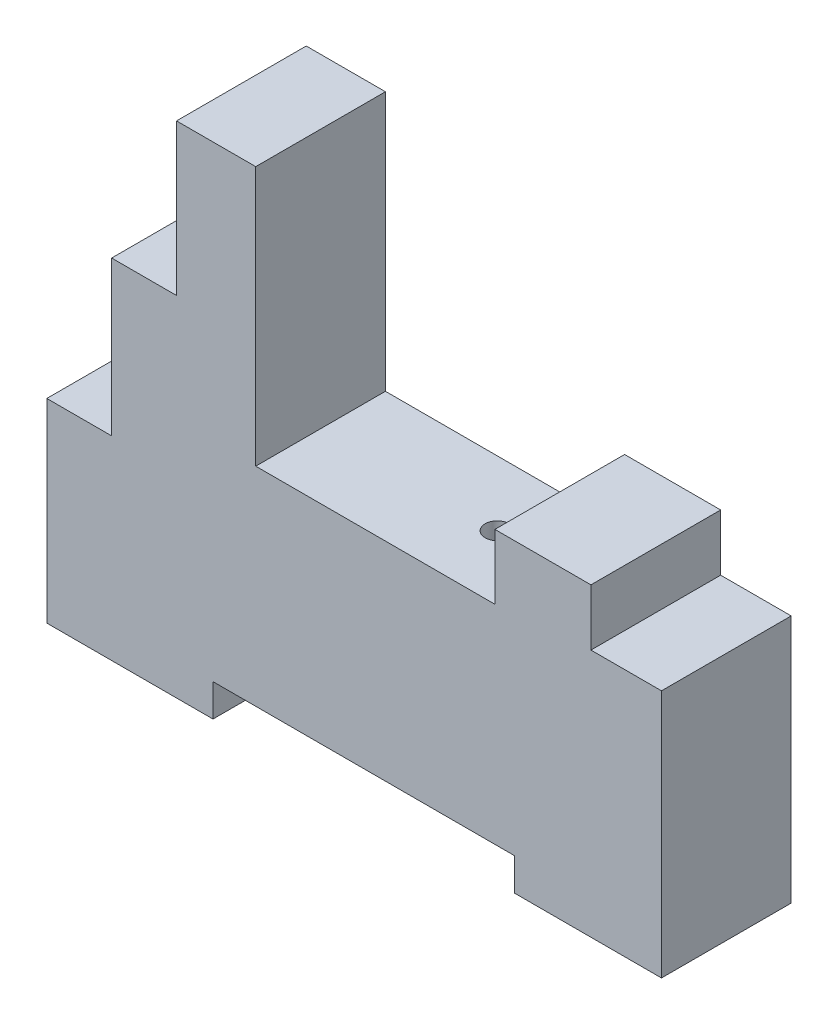
ISO-10303-21;
HEADER;
FILE_DESCRIPTION(('STEP AP214'),'2;1');
FILE_NAME('part.step','',(''),(''),'','','');
FILE_SCHEMA(('AUTOMOTIVE_DESIGN { 1 0 10303 214 1 1 1 1 }'));
ENDSEC;
DATA;
#1=APPLICATION_CONTEXT('core data for automotive mechanical design processes');
#2=APPLICATION_PROTOCOL_DEFINITION('international standard','automotive_design',2000,#1);
#3=PRODUCT_CONTEXT('',#1,'mechanical');
#4=PRODUCT('Part','Part','',(#3));
#5=PRODUCT_RELATED_PRODUCT_CATEGORY('part','',(#4));
#6=PRODUCT_DEFINITION_FORMATION('','',#4);
#7=PRODUCT_DEFINITION_CONTEXT('part definition',#1,'design');
#8=PRODUCT_DEFINITION('design','',#6,#7);
#9=PRODUCT_DEFINITION_SHAPE('','',#8);
#10=(LENGTH_UNIT() NAMED_UNIT(*) SI_UNIT(.MILLI.,.METRE.));
#11=(NAMED_UNIT(*) PLANE_ANGLE_UNIT() SI_UNIT($,.RADIAN.));
#12=(NAMED_UNIT(*) SI_UNIT($,.STERADIAN.) SOLID_ANGLE_UNIT());
#13=UNCERTAINTY_MEASURE_WITH_UNIT(LENGTH_MEASURE(1.E-05),#10,'distance_accuracy_value','');
#14=(GEOMETRIC_REPRESENTATION_CONTEXT(3) GLOBAL_UNCERTAINTY_ASSIGNED_CONTEXT((#13)) GLOBAL_UNIT_ASSIGNED_CONTEXT((#10,
#11,#12)) REPRESENTATION_CONTEXT('',''));
#15=CARTESIAN_POINT('',(0.,0.,0.));
#16=DIRECTION('',(0.,0.,1.));
#17=DIRECTION('',(1.,0.,0.));
#18=AXIS2_PLACEMENT_3D('',#15,#16,#17);
#19=CARTESIAN_POINT('',(20.5,0.,16.));
#20=DIRECTION('',(0.,1.,0.));
#21=DIRECTION('',(-1.,0.,0.));
#22=AXIS2_PLACEMENT_3D('',#19,#20,#21);
#23=PLANE('',#22);
#24=DIRECTION('',(1.,0.,0.));
#25=VECTOR('',#24,1.);
#26=CARTESIAN_POINT('',(20.5,0.,0.));
#27=LINE('',#26,#25);
#28=CARTESIAN_POINT('',(0.,0.,0.));
#29=VERTEX_POINT('',#28);
#30=CARTESIAN_POINT('',(20.5,0.,0.));
#31=VERTEX_POINT('',#30);
#32=EDGE_CURVE('E188',#29,#31,#27,.T.);
#33=ORIENTED_EDGE('',*,*,#32,.T.);
#34=DIRECTION('',(0.,0.,-1.));
#35=VECTOR('',#34,1.);
#36=CARTESIAN_POINT('',(20.5,0.,16.));
#37=LINE('',#36,#35);
#38=CARTESIAN_POINT('',(20.5,0.,16.));
#39=VERTEX_POINT('',#38);
#40=EDGE_CURVE('E11',#39,#31,#37,.T.);
#41=ORIENTED_EDGE('',*,*,#40,.F.);
#42=DIRECTION('',(1.,0.,0.));
#43=VECTOR('',#42,1.);
#44=CARTESIAN_POINT('',(20.5,0.,16.));
#45=LINE('',#44,#43);
#46=CARTESIAN_POINT('',(0.,0.,16.));
#47=VERTEX_POINT('',#46);
#48=EDGE_CURVE('E223',#47,#39,#45,.T.);
#49=ORIENTED_EDGE('',*,*,#48,.F.);
#50=DIRECTION('',(0.,0.,-1.));
#51=VECTOR('',#50,1.);
#52=CARTESIAN_POINT('',(0.,0.,16.));
#53=LINE('',#52,#51);
#54=EDGE_CURVE('E184',#47,#29,#53,.T.);
#55=ORIENTED_EDGE('',*,*,#54,.T.);
#56=EDGE_LOOP('',(#33,#41,#49,#55));
#57=FACE_BOUND('',#56,.T.);
#58=ADVANCED_FACE('F32',(#57),#23,.F.);
#59=CARTESIAN_POINT('',(20.5,4.,16.));
#60=DIRECTION('',(-1.,0.,0.));
#61=DIRECTION('',(0.,0.,1.));
#62=AXIS2_PLACEMENT_3D('',#59,#60,#61);
#63=PLANE('',#62);
#64=DIRECTION('',(0.,1.,0.));
#65=VECTOR('',#64,1.);
#66=CARTESIAN_POINT('',(20.5,4.,0.));
#67=LINE('',#66,#65);
#68=CARTESIAN_POINT('',(20.5,4.,0.));
#69=VERTEX_POINT('',#68);
#70=EDGE_CURVE('E191',#31,#69,#67,.T.);
#71=ORIENTED_EDGE('',*,*,#70,.T.);
#72=DIRECTION('',(0.,0.,-1.));
#73=VECTOR('',#72,1.);
#74=CARTESIAN_POINT('',(20.5,4.,16.));
#75=LINE('',#74,#73);
#76=CARTESIAN_POINT('',(20.5,4.,16.));
#77=VERTEX_POINT('',#76);
#78=EDGE_CURVE('E40',#77,#69,#75,.T.);
#79=ORIENTED_EDGE('',*,*,#78,.F.);
#80=DIRECTION('',(0.,1.,0.));
#81=VECTOR('',#80,1.);
#82=CARTESIAN_POINT('',(20.5,4.,16.));
#83=LINE('',#82,#81);
#84=EDGE_CURVE('E121',#39,#77,#83,.T.);
#85=ORIENTED_EDGE('',*,*,#84,.F.);
#86=ORIENTED_EDGE('',*,*,#40,.T.);
#87=EDGE_LOOP('',(#71,#79,#85,#86));
#88=FACE_BOUND('',#87,.T.);
#89=ADVANCED_FACE('F331',(#88),#63,.F.);
#90=CARTESIAN_POINT('',(57.7,4.,16.));
#91=DIRECTION('',(0.,1.,0.));
#92=DIRECTION('',(-1.,0.,0.));
#93=AXIS2_PLACEMENT_3D('',#90,#91,#92);
#94=PLANE('',#93);
#95=CARTESIAN_POINT('',(47.57,4.,8.));
#96=DIRECTION('',(0.,1.,0.));
#97=DIRECTION('',(-1.,0.,0.));
#98=AXIS2_PLACEMENT_3D('',#95,#96,#97);
#99=CIRCLE('',#98,1.5);
#100=CARTESIAN_POINT('',(47.57,4.,9.50000000000001));
#101=VERTEX_POINT('',#100);
#102=EDGE_CURVE('E192',#101,#101,#99,.T.);
#103=ORIENTED_EDGE('',*,*,#102,.T.);
#104=EDGE_LOOP('',(#103));
#105=FACE_BOUND('',#104,.T.);
#106=DIRECTION('',(1.,0.,0.));
#107=VECTOR('',#106,1.);
#108=CARTESIAN_POINT('',(57.7,4.,0.));
#109=LINE('',#108,#107);
#110=CARTESIAN_POINT('',(57.7,4.,0.));
#111=VERTEX_POINT('',#110);
#112=EDGE_CURVE('E194',#69,#111,#109,.T.);
#113=ORIENTED_EDGE('',*,*,#112,.T.);
#114=DIRECTION('',(0.,0.,-1.));
#115=VECTOR('',#114,1.);
#116=CARTESIAN_POINT('',(57.7,4.,16.));
#117=LINE('',#116,#115);
#118=CARTESIAN_POINT('',(57.7,4.,16.));
#119=VERTEX_POINT('',#118);
#120=EDGE_CURVE('E260',#119,#111,#117,.T.);
#121=ORIENTED_EDGE('',*,*,#120,.F.);
#122=DIRECTION('',(1.,0.,0.));
#123=VECTOR('',#122,1.);
#124=CARTESIAN_POINT('',(57.7,4.,16.));
#125=LINE('',#124,#123);
#126=EDGE_CURVE('E268',#77,#119,#125,.T.);
#127=ORIENTED_EDGE('',*,*,#126,.F.);
#128=ORIENTED_EDGE('',*,*,#78,.T.);
#129=EDGE_LOOP('',(#113,#121,#127,#128));
#130=FACE_BOUND('',#129,.T.);
#131=ADVANCED_FACE('F266',(#105,#130),#94,.F.);
#132=CARTESIAN_POINT('',(57.7,0.,16.));
#133=DIRECTION('',(1.,0.,0.));
#134=DIRECTION('',(0.,0.,-1.));
#135=AXIS2_PLACEMENT_3D('',#132,#133,#134);
#136=PLANE('',#135);
#137=DIRECTION('',(0.,-1.,0.));
#138=VECTOR('',#137,1.);
#139=CARTESIAN_POINT('',(57.7,0.,0.));
#140=LINE('',#139,#138);
#141=CARTESIAN_POINT('',(57.7,0.,0.));
#142=VERTEX_POINT('',#141);
#143=EDGE_CURVE('E196',#111,#142,#140,.T.);
#144=ORIENTED_EDGE('',*,*,#143,.T.);
#145=DIRECTION('',(0.,0.,-1.));
#146=VECTOR('',#145,1.);
#147=CARTESIAN_POINT('',(57.7,0.,16.));
#148=LINE('',#147,#146);
#149=CARTESIAN_POINT('',(57.7,0.,16.));
#150=VERTEX_POINT('',#149);
#151=EDGE_CURVE('E257',#150,#142,#148,.T.);
#152=ORIENTED_EDGE('',*,*,#151,.F.);
#153=DIRECTION('',(0.,-1.,0.));
#154=VECTOR('',#153,1.);
#155=CARTESIAN_POINT('',(57.7,0.,16.));
#156=LINE('',#155,#154);
#157=EDGE_CURVE('E286',#119,#150,#156,.T.);
#158=ORIENTED_EDGE('',*,*,#157,.F.);
#159=ORIENTED_EDGE('',*,*,#120,.T.);
#160=EDGE_LOOP('',(#144,#152,#158,#159));
#161=FACE_BOUND('',#160,.T.);
#162=ADVANCED_FACE('F277',(#161),#136,.F.);
#163=CARTESIAN_POINT('',(75.82,0.,16.));
#164=DIRECTION('',(0.,1.,0.));
#165=DIRECTION('',(-1.,0.,0.));
#166=AXIS2_PLACEMENT_3D('',#163,#164,#165);
#167=PLANE('',#166);
#168=DIRECTION('',(1.,0.,0.));
#169=VECTOR('',#168,1.);
#170=CARTESIAN_POINT('',(75.82,0.,0.));
#171=LINE('',#170,#169);
#172=CARTESIAN_POINT('',(75.82,0.,0.));
#173=VERTEX_POINT('',#172);
#174=EDGE_CURVE('E198',#142,#173,#171,.T.);
#175=ORIENTED_EDGE('',*,*,#174,.T.);
#176=DIRECTION('',(0.,0.,-1.));
#177=VECTOR('',#176,1.);
#178=CARTESIAN_POINT('',(75.82,0.,16.));
#179=LINE('',#178,#177);
#180=CARTESIAN_POINT('',(75.82,0.,16.));
#181=VERTEX_POINT('',#180);
#182=EDGE_CURVE('E254',#181,#173,#179,.T.);
#183=ORIENTED_EDGE('',*,*,#182,.F.);
#184=DIRECTION('',(1.,0.,0.));
#185=VECTOR('',#184,1.);
#186=CARTESIAN_POINT('',(75.82,0.,16.));
#187=LINE('',#186,#185);
#188=EDGE_CURVE('E283',#150,#181,#187,.T.);
#189=ORIENTED_EDGE('',*,*,#188,.F.);
#190=ORIENTED_EDGE('',*,*,#151,.T.);
#191=EDGE_LOOP('',(#175,#183,#189,#190));
#192=FACE_BOUND('',#191,.T.);
#193=ADVANCED_FACE('F281',(#192),#167,.F.);
#194=CARTESIAN_POINT('',(75.82,30.68,16.));
#195=DIRECTION('',(-1.,0.,0.));
#196=DIRECTION('',(0.,0.,1.));
#197=AXIS2_PLACEMENT_3D('',#194,#195,#196);
#198=PLANE('',#197);
#199=DIRECTION('',(0.,1.,0.));
#200=VECTOR('',#199,1.);
#201=CARTESIAN_POINT('',(75.82,30.68,0.));
#202=LINE('',#201,#200);
#203=CARTESIAN_POINT('',(75.82,30.68,0.));
#204=VERTEX_POINT('',#203);
#205=EDGE_CURVE('E200',#173,#204,#202,.T.);
#206=ORIENTED_EDGE('',*,*,#205,.T.);
#207=DIRECTION('',(0.,0.,-1.));
#208=VECTOR('',#207,1.);
#209=CARTESIAN_POINT('',(75.82,30.68,16.));
#210=LINE('',#209,#208);
#211=CARTESIAN_POINT('',(75.82,30.68,16.));
#212=VERTEX_POINT('',#211);
#213=EDGE_CURVE('E251',#212,#204,#210,.T.);
#214=ORIENTED_EDGE('',*,*,#213,.F.);
#215=DIRECTION('',(0.,1.,0.));
#216=VECTOR('',#215,1.);
#217=CARTESIAN_POINT('',(75.82,30.68,16.));
#218=LINE('',#217,#216);
#219=EDGE_CURVE('E285',#181,#212,#218,.T.);
#220=ORIENTED_EDGE('',*,*,#219,.F.);
#221=ORIENTED_EDGE('',*,*,#182,.T.);
#222=EDGE_LOOP('',(#206,#214,#220,#221));
#223=FACE_BOUND('',#222,.T.);
#224=ADVANCED_FACE('F345',(#223),#198,.F.);
#225=CARTESIAN_POINT('',(67.12,30.68,16.));
#226=DIRECTION('',(0.,-1.,0.));
#227=DIRECTION('',(0.,0.,-1.));
#228=AXIS2_PLACEMENT_3D('',#225,#226,#227);
#229=PLANE('',#228);
#230=DIRECTION('',(-1.,0.,0.));
#231=VECTOR('',#230,1.);
#232=CARTESIAN_POINT('',(67.12,30.68,0.));
#233=LINE('',#232,#231);
#234=CARTESIAN_POINT('',(67.12,30.68,0.));
#235=VERTEX_POINT('',#234);
#236=EDGE_CURVE('E202',#204,#235,#233,.T.);
#237=ORIENTED_EDGE('',*,*,#236,.T.);
#238=DIRECTION('',(0.,0.,-1.));
#239=VECTOR('',#238,1.);
#240=CARTESIAN_POINT('',(67.12,30.68,16.));
#241=LINE('',#240,#239);
#242=CARTESIAN_POINT('',(67.12,30.68,16.));
#243=VERTEX_POINT('',#242);
#244=EDGE_CURVE('E248',#243,#235,#241,.T.);
#245=ORIENTED_EDGE('',*,*,#244,.F.);
#246=DIRECTION('',(-1.,0.,0.));
#247=VECTOR('',#246,1.);
#248=CARTESIAN_POINT('',(67.12,30.68,16.));
#249=LINE('',#248,#247);
#250=EDGE_CURVE('E288',#212,#243,#249,.T.);
#251=ORIENTED_EDGE('',*,*,#250,.F.);
#252=ORIENTED_EDGE('',*,*,#213,.T.);
#253=EDGE_LOOP('',(#237,#245,#251,#252));
#254=FACE_BOUND('',#253,.T.);
#255=ADVANCED_FACE('F348',(#254),#229,.F.);
#256=CARTESIAN_POINT('',(67.12,37.65,16.));
#257=DIRECTION('',(-1.,0.,0.));
#258=DIRECTION('',(0.,0.,1.));
#259=AXIS2_PLACEMENT_3D('',#256,#257,#258);
#260=PLANE('',#259);
#261=DIRECTION('',(0.,1.,0.));
#262=VECTOR('',#261,1.);
#263=CARTESIAN_POINT('',(67.12,37.65,0.));
#264=LINE('',#263,#262);
#265=CARTESIAN_POINT('',(67.12,37.65,0.));
#266=VERTEX_POINT('',#265);
#267=EDGE_CURVE('E204',#235,#266,#264,.T.);
#268=ORIENTED_EDGE('',*,*,#267,.T.);
#269=DIRECTION('',(0.,0.,-1.));
#270=VECTOR('',#269,1.);
#271=CARTESIAN_POINT('',(67.12,37.65,16.));
#272=LINE('',#271,#270);
#273=CARTESIAN_POINT('',(67.12,37.65,16.));
#274=VERTEX_POINT('',#273);
#275=EDGE_CURVE('E245',#274,#266,#272,.T.);
#276=ORIENTED_EDGE('',*,*,#275,.F.);
#277=DIRECTION('',(0.,1.,0.));
#278=VECTOR('',#277,1.);
#279=CARTESIAN_POINT('',(67.12,37.65,16.));
#280=LINE('',#279,#278);
#281=EDGE_CURVE('E294',#243,#274,#280,.T.);
#282=ORIENTED_EDGE('',*,*,#281,.F.);
#283=ORIENTED_EDGE('',*,*,#244,.T.);
#284=EDGE_LOOP('',(#268,#276,#282,#283));
#285=FACE_BOUND('',#284,.T.);
#286=ADVANCED_FACE('F352',(#285),#260,.F.);
#287=CARTESIAN_POINT('',(55.27,37.65,16.));
#288=DIRECTION('',(0.,-1.,0.));
#289=DIRECTION('',(0.,0.,-1.));
#290=AXIS2_PLACEMENT_3D('',#287,#288,#289);
#291=PLANE('',#290);
#292=DIRECTION('',(-1.,0.,0.));
#293=VECTOR('',#292,1.);
#294=CARTESIAN_POINT('',(55.27,37.65,0.));
#295=LINE('',#294,#293);
#296=CARTESIAN_POINT('',(55.27,37.65,0.));
#297=VERTEX_POINT('',#296);
#298=EDGE_CURVE('E206',#266,#297,#295,.T.);
#299=ORIENTED_EDGE('',*,*,#298,.T.);
#300=DIRECTION('',(0.,0.,-1.));
#301=VECTOR('',#300,1.);
#302=CARTESIAN_POINT('',(55.27,37.65,16.));
#303=LINE('',#302,#301);
#304=CARTESIAN_POINT('',(55.27,37.65,16.));
#305=VERTEX_POINT('',#304);
#306=EDGE_CURVE('E242',#305,#297,#303,.T.);
#307=ORIENTED_EDGE('',*,*,#306,.F.);
#308=DIRECTION('',(-1.,0.,0.));
#309=VECTOR('',#308,1.);
#310=CARTESIAN_POINT('',(55.27,37.65,16.));
#311=LINE('',#310,#309);
#312=EDGE_CURVE('E296',#274,#305,#311,.T.);
#313=ORIENTED_EDGE('',*,*,#312,.F.);
#314=ORIENTED_EDGE('',*,*,#275,.T.);
#315=EDGE_LOOP('',(#299,#307,#313,#314));
#316=FACE_BOUND('',#315,.T.);
#317=ADVANCED_FACE('F356',(#316),#291,.F.);
#318=CARTESIAN_POINT('',(55.27,29.65,16.));
#319=DIRECTION('',(1.,0.,0.));
#320=DIRECTION('',(0.,0.,-1.));
#321=AXIS2_PLACEMENT_3D('',#318,#319,#320);
#322=PLANE('',#321);
#323=DIRECTION('',(0.,-1.,0.));
#324=VECTOR('',#323,1.);
#325=CARTESIAN_POINT('',(55.27,29.65,0.));
#326=LINE('',#325,#324);
#327=CARTESIAN_POINT('',(55.27,29.65,0.));
#328=VERTEX_POINT('',#327);
#329=EDGE_CURVE('E208',#297,#328,#326,.T.);
#330=ORIENTED_EDGE('',*,*,#329,.T.);
#331=DIRECTION('',(0.,0.,-1.));
#332=VECTOR('',#331,1.);
#333=CARTESIAN_POINT('',(55.27,29.65,16.));
#334=LINE('',#333,#332);
#335=CARTESIAN_POINT('',(55.27,29.65,16.));
#336=VERTEX_POINT('',#335);
#337=EDGE_CURVE('E239',#336,#328,#334,.T.);
#338=ORIENTED_EDGE('',*,*,#337,.F.);
#339=DIRECTION('',(0.,-1.,0.));
#340=VECTOR('',#339,1.);
#341=CARTESIAN_POINT('',(55.27,29.65,16.));
#342=LINE('',#341,#340);
#343=EDGE_CURVE('E298',#305,#336,#342,.T.);
#344=ORIENTED_EDGE('',*,*,#343,.F.);
#345=ORIENTED_EDGE('',*,*,#306,.T.);
#346=EDGE_LOOP('',(#330,#338,#344,#345));
#347=FACE_BOUND('',#346,.T.);
#348=ADVANCED_FACE('F360',(#347),#322,.F.);
#349=CARTESIAN_POINT('',(25.77,29.65,16.));
#350=DIRECTION('',(0.,-1.,0.));
#351=DIRECTION('',(0.,0.,-1.));
#352=AXIS2_PLACEMENT_3D('',#349,#350,#351);
#353=PLANE('',#352);
#354=CARTESIAN_POINT('',(47.57,29.65,8.));
#355=DIRECTION('',(0.,1.,0.));
#356=DIRECTION('',(0.,0.,1.));
#357=AXIS2_PLACEMENT_3D('',#354,#355,#356);
#358=CIRCLE('',#357,1.5);
#359=CARTESIAN_POINT('',(47.57,29.65,9.50000000000001));
#360=VERTEX_POINT('',#359);
#361=EDGE_CURVE('E440',#360,#360,#358,.T.);
#362=ORIENTED_EDGE('',*,*,#361,.F.);
#363=EDGE_LOOP('',(#362));
#364=FACE_BOUND('',#363,.T.);
#365=DIRECTION('',(-1.,0.,0.));
#366=VECTOR('',#365,1.);
#367=CARTESIAN_POINT('',(25.77,29.65,0.));
#368=LINE('',#367,#366);
#369=CARTESIAN_POINT('',(25.77,29.65,0.));
#370=VERTEX_POINT('',#369);
#371=EDGE_CURVE('E210',#328,#370,#368,.T.);
#372=ORIENTED_EDGE('',*,*,#371,.T.);
#373=DIRECTION('',(0.,0.,-1.));
#374=VECTOR('',#373,1.);
#375=CARTESIAN_POINT('',(25.77,29.65,16.));
#376=LINE('',#375,#374);
#377=CARTESIAN_POINT('',(25.77,29.65,16.));
#378=VERTEX_POINT('',#377);
#379=EDGE_CURVE('E236',#378,#370,#376,.T.);
#380=ORIENTED_EDGE('',*,*,#379,.F.);
#381=DIRECTION('',(-1.,0.,0.));
#382=VECTOR('',#381,1.);
#383=CARTESIAN_POINT('',(25.77,29.65,16.));
#384=LINE('',#383,#382);
#385=EDGE_CURVE('E300',#336,#378,#384,.T.);
#386=ORIENTED_EDGE('',*,*,#385,.F.);
#387=ORIENTED_EDGE('',*,*,#337,.T.);
#388=EDGE_LOOP('',(#372,#380,#386,#387));
#389=FACE_BOUND('',#388,.T.);
#390=ADVANCED_FACE('F364',(#364,#389),#353,.F.);
#391=CARTESIAN_POINT('',(25.77,61.65,16.));
#392=DIRECTION('',(-1.,0.,0.));
#393=DIRECTION('',(0.,-1.,0.));
#394=AXIS2_PLACEMENT_3D('',#391,#392,#393);
#395=PLANE('',#394);
#396=DIRECTION('',(0.,1.,0.));
#397=VECTOR('',#396,1.);
#398=CARTESIAN_POINT('',(25.77,61.65,0.));
#399=LINE('',#398,#397);
#400=CARTESIAN_POINT('',(25.77,61.65,0.));
#401=VERTEX_POINT('',#400);
#402=EDGE_CURVE('E212',#370,#401,#399,.T.);
#403=ORIENTED_EDGE('',*,*,#402,.T.);
#404=DIRECTION('',(0.,0.,-1.));
#405=VECTOR('',#404,1.);
#406=CARTESIAN_POINT('',(25.77,61.65,16.));
#407=LINE('',#406,#405);
#408=CARTESIAN_POINT('',(25.77,61.65,16.));
#409=VERTEX_POINT('',#408);
#410=EDGE_CURVE('E233',#409,#401,#407,.T.);
#411=ORIENTED_EDGE('',*,*,#410,.F.);
#412=DIRECTION('',(0.,1.,0.));
#413=VECTOR('',#412,1.);
#414=CARTESIAN_POINT('',(25.77,61.65,16.));
#415=LINE('',#414,#413);
#416=EDGE_CURVE('E302',#378,#409,#415,.T.);
#417=ORIENTED_EDGE('',*,*,#416,.F.);
#418=ORIENTED_EDGE('',*,*,#379,.T.);
#419=EDGE_LOOP('',(#403,#411,#417,#418));
#420=FACE_BOUND('',#419,.T.);
#421=ADVANCED_FACE('F368',(#420),#395,.F.);
#422=CARTESIAN_POINT('',(16.,61.65,16.));
#423=DIRECTION('',(0.,-1.,0.));
#424=DIRECTION('',(0.,0.,-1.));
#425=AXIS2_PLACEMENT_3D('',#422,#423,#424);
#426=PLANE('',#425);
#427=DIRECTION('',(-1.,0.,0.));
#428=VECTOR('',#427,1.);
#429=CARTESIAN_POINT('',(16.,61.65,0.));
#430=LINE('',#429,#428);
#431=CARTESIAN_POINT('',(16.,61.65,0.));
#432=VERTEX_POINT('',#431);
#433=EDGE_CURVE('E214',#401,#432,#430,.T.);
#434=ORIENTED_EDGE('',*,*,#433,.T.);
#435=DIRECTION('',(0.,0.,-1.));
#436=VECTOR('',#435,1.);
#437=CARTESIAN_POINT('',(16.,61.65,16.));
#438=LINE('',#437,#436);
#439=CARTESIAN_POINT('',(16.,61.65,16.));
#440=VERTEX_POINT('',#439);
#441=EDGE_CURVE('E230',#440,#432,#438,.T.);
#442=ORIENTED_EDGE('',*,*,#441,.F.);
#443=DIRECTION('',(-1.,0.,0.));
#444=VECTOR('',#443,1.);
#445=CARTESIAN_POINT('',(16.,61.65,16.));
#446=LINE('',#445,#444);
#447=EDGE_CURVE('E304',#409,#440,#446,.T.);
#448=ORIENTED_EDGE('',*,*,#447,.F.);
#449=ORIENTED_EDGE('',*,*,#410,.T.);
#450=EDGE_LOOP('',(#434,#442,#448,#449));
#451=FACE_BOUND('',#450,.T.);
#452=ADVANCED_FACE('F372',(#451),#426,.F.);
#453=CARTESIAN_POINT('',(16.,43.,16.));
#454=DIRECTION('',(1.,0.,0.));
#455=DIRECTION('',(0.,0.,-1.));
#456=AXIS2_PLACEMENT_3D('',#453,#454,#455);
#457=PLANE('',#456);
#458=DIRECTION('',(0.,-1.,0.));
#459=VECTOR('',#458,1.);
#460=CARTESIAN_POINT('',(16.,43.,0.));
#461=LINE('',#460,#459);
#462=CARTESIAN_POINT('',(16.,43.,0.));
#463=VERTEX_POINT('',#462);
#464=EDGE_CURVE('E216',#432,#463,#461,.T.);
#465=ORIENTED_EDGE('',*,*,#464,.T.);
#466=DIRECTION('',(0.,0.,-1.));
#467=VECTOR('',#466,1.);
#468=CARTESIAN_POINT('',(16.,43.,16.));
#469=LINE('',#468,#467);
#470=CARTESIAN_POINT('',(16.,43.,16.));
#471=VERTEX_POINT('',#470);
#472=EDGE_CURVE('E227',#471,#463,#469,.T.);
#473=ORIENTED_EDGE('',*,*,#472,.F.);
#474=DIRECTION('',(0.,-1.,0.));
#475=VECTOR('',#474,1.);
#476=CARTESIAN_POINT('',(16.,43.,16.));
#477=LINE('',#476,#475);
#478=EDGE_CURVE('E306',#440,#471,#477,.T.);
#479=ORIENTED_EDGE('',*,*,#478,.F.);
#480=ORIENTED_EDGE('',*,*,#441,.T.);
#481=EDGE_LOOP('',(#465,#473,#479,#480));
#482=FACE_BOUND('',#481,.T.);
#483=ADVANCED_FACE('F312',(#482),#457,.F.);
#484=CARTESIAN_POINT('',(8.,43.,16.));
#485=DIRECTION('',(0.,-1.,0.));
#486=DIRECTION('',(0.,0.,-1.));
#487=AXIS2_PLACEMENT_3D('',#484,#485,#486);
#488=PLANE('',#487);
#489=DIRECTION('',(-1.,0.,0.));
#490=VECTOR('',#489,1.);
#491=CARTESIAN_POINT('',(8.,43.,0.));
#492=LINE('',#491,#490);
#493=CARTESIAN_POINT('',(8.,43.,0.));
#494=VERTEX_POINT('',#493);
#495=EDGE_CURVE('E218',#463,#494,#492,.T.);
#496=ORIENTED_EDGE('',*,*,#495,.T.);
#497=DIRECTION('',(0.,0.,-1.));
#498=VECTOR('',#497,1.);
#499=CARTESIAN_POINT('',(8.,43.,16.));
#500=LINE('',#499,#498);
#501=CARTESIAN_POINT('',(8.,43.,16.));
#502=VERTEX_POINT('',#501);
#503=EDGE_CURVE('E179',#502,#494,#500,.T.);
#504=ORIENTED_EDGE('',*,*,#503,.F.);
#505=DIRECTION('',(-1.,0.,0.));
#506=VECTOR('',#505,1.);
#507=CARTESIAN_POINT('',(8.,43.,16.));
#508=LINE('',#507,#506);
#509=EDGE_CURVE('E170',#471,#502,#508,.T.);
#510=ORIENTED_EDGE('',*,*,#509,.F.);
#511=ORIENTED_EDGE('',*,*,#472,.T.);
#512=EDGE_LOOP('',(#496,#504,#510,#511));
#513=FACE_BOUND('',#512,.T.);
#514=ADVANCED_FACE('F316',(#513),#488,.F.);
#515=CARTESIAN_POINT('',(8.,24.,16.));
#516=DIRECTION('',(1.,0.,0.));
#517=DIRECTION('',(0.,0.,-1.));
#518=AXIS2_PLACEMENT_3D('',#515,#516,#517);
#519=PLANE('',#518);
#520=DIRECTION('',(0.,-1.,0.));
#521=VECTOR('',#520,1.);
#522=CARTESIAN_POINT('',(8.,24.,0.));
#523=LINE('',#522,#521);
#524=CARTESIAN_POINT('',(8.,24.,0.));
#525=VERTEX_POINT('',#524);
#526=EDGE_CURVE('E178',#494,#525,#523,.T.);
#527=ORIENTED_EDGE('',*,*,#526,.T.);
#528=DIRECTION('',(0.,0.,-1.));
#529=VECTOR('',#528,1.);
#530=CARTESIAN_POINT('',(8.,24.,16.));
#531=LINE('',#530,#529);
#532=CARTESIAN_POINT('',(8.,24.,16.));
#533=VERTEX_POINT('',#532);
#534=EDGE_CURVE('E175',#533,#525,#531,.T.);
#535=ORIENTED_EDGE('',*,*,#534,.F.);
#536=DIRECTION('',(0.,-1.,0.));
#537=VECTOR('',#536,1.);
#538=CARTESIAN_POINT('',(8.,24.,16.));
#539=LINE('',#538,#537);
#540=EDGE_CURVE('E164',#502,#533,#539,.T.);
#541=ORIENTED_EDGE('',*,*,#540,.F.);
#542=ORIENTED_EDGE('',*,*,#503,.T.);
#543=EDGE_LOOP('',(#527,#535,#541,#542));
#544=FACE_BOUND('',#543,.T.);
#545=ADVANCED_FACE('F176',(#544),#519,.F.);
#546=CARTESIAN_POINT('',(0.,24.,16.));
#547=DIRECTION('',(0.,-1.,0.));
#548=DIRECTION('',(0.,0.,-1.));
#549=AXIS2_PLACEMENT_3D('',#546,#547,#548);
#550=PLANE('',#549);
#551=DIRECTION('',(-1.,0.,0.));
#552=VECTOR('',#551,1.);
#553=CARTESIAN_POINT('',(0.,24.,0.));
#554=LINE('',#553,#552);
#555=CARTESIAN_POINT('',(0.,24.,0.));
#556=VERTEX_POINT('',#555);
#557=EDGE_CURVE('E107',#525,#556,#554,.T.);
#558=ORIENTED_EDGE('',*,*,#557,.T.);
#559=DIRECTION('',(0.,0.,-1.));
#560=VECTOR('',#559,1.);
#561=CARTESIAN_POINT('',(0.,24.,16.));
#562=LINE('',#561,#560);
#563=CARTESIAN_POINT('',(0.,24.,16.));
#564=VERTEX_POINT('',#563);
#565=EDGE_CURVE('E180',#564,#556,#562,.T.);
#566=ORIENTED_EDGE('',*,*,#565,.F.);
#567=DIRECTION('',(-1.,0.,0.));
#568=VECTOR('',#567,1.);
#569=CARTESIAN_POINT('',(0.,24.,16.));
#570=LINE('',#569,#568);
#571=EDGE_CURVE('E168',#533,#564,#570,.T.);
#572=ORIENTED_EDGE('',*,*,#571,.F.);
#573=ORIENTED_EDGE('',*,*,#534,.T.);
#574=EDGE_LOOP('',(#558,#566,#572,#573));
#575=FACE_BOUND('',#574,.T.);
#576=ADVANCED_FACE('F182',(#575),#550,.F.);
#577=CARTESIAN_POINT('',(0.,0.,16.));
#578=DIRECTION('',(1.,0.,0.));
#579=DIRECTION('',(0.,0.,-1.));
#580=AXIS2_PLACEMENT_3D('',#577,#578,#579);
#581=PLANE('',#580);
#582=DIRECTION('',(0.,-1.,0.));
#583=VECTOR('',#582,1.);
#584=CARTESIAN_POINT('',(0.,0.,0.));
#585=LINE('',#584,#583);
#586=EDGE_CURVE('E113',#556,#29,#585,.T.);
#587=ORIENTED_EDGE('',*,*,#586,.T.);
#588=ORIENTED_EDGE('',*,*,#54,.F.);
#589=DIRECTION('',(0.,-1.,0.));
#590=VECTOR('',#589,1.);
#591=CARTESIAN_POINT('',(0.,0.,16.));
#592=LINE('',#591,#590);
#593=EDGE_CURVE('E48',#564,#47,#592,.T.);
#594=ORIENTED_EDGE('',*,*,#593,.F.);
#595=ORIENTED_EDGE('',*,*,#565,.T.);
#596=EDGE_LOOP('',(#587,#588,#594,#595));
#597=FACE_BOUND('',#596,.T.);
#598=ADVANCED_FACE('F320',(#597),#581,.F.);
#599=CARTESIAN_POINT('',(0.,0.,16.));
#600=DIRECTION('',(0.,0.,-1.));
#601=DIRECTION('',(-1.,0.,0.));
#602=AXIS2_PLACEMENT_3D('',#599,#600,#601);
#603=PLANE('',#602);
#604=ORIENTED_EDGE('',*,*,#48,.T.);
#605=ORIENTED_EDGE('',*,*,#84,.T.);
#606=ORIENTED_EDGE('',*,*,#126,.T.);
#607=ORIENTED_EDGE('',*,*,#157,.T.);
#608=ORIENTED_EDGE('',*,*,#188,.T.);
#609=ORIENTED_EDGE('',*,*,#219,.T.);
#610=ORIENTED_EDGE('',*,*,#250,.T.);
#611=ORIENTED_EDGE('',*,*,#281,.T.);
#612=ORIENTED_EDGE('',*,*,#312,.T.);
#613=ORIENTED_EDGE('',*,*,#343,.T.);
#614=ORIENTED_EDGE('',*,*,#385,.T.);
#615=ORIENTED_EDGE('',*,*,#416,.T.);
#616=ORIENTED_EDGE('',*,*,#447,.T.);
#617=ORIENTED_EDGE('',*,*,#478,.T.);
#618=ORIENTED_EDGE('',*,*,#509,.T.);
#619=ORIENTED_EDGE('',*,*,#540,.T.);
#620=ORIENTED_EDGE('',*,*,#571,.T.);
#621=ORIENTED_EDGE('',*,*,#593,.T.);
#622=EDGE_LOOP('',(#604,#605,#606,#607,#608,#609,#610,#611,#612,#613,#614,#615,#616,#617,#618,
#619,#620,#621));
#623=FACE_BOUND('',#622,.T.);
#624=ADVANCED_FACE('F166',(#623),#603,.F.);
#625=CARTESIAN_POINT('',(0.,0.,0.));
#626=DIRECTION('',(0.,0.,-1.));
#627=DIRECTION('',(-1.,0.,0.));
#628=AXIS2_PLACEMENT_3D('',#625,#626,#627);
#629=PLANE('',#628);
#630=ORIENTED_EDGE('',*,*,#32,.F.);
#631=ORIENTED_EDGE('',*,*,#586,.F.);
#632=ORIENTED_EDGE('',*,*,#557,.F.);
#633=ORIENTED_EDGE('',*,*,#526,.F.);
#634=ORIENTED_EDGE('',*,*,#495,.F.);
#635=ORIENTED_EDGE('',*,*,#464,.F.);
#636=ORIENTED_EDGE('',*,*,#433,.F.);
#637=ORIENTED_EDGE('',*,*,#402,.F.);
#638=ORIENTED_EDGE('',*,*,#371,.F.);
#639=ORIENTED_EDGE('',*,*,#329,.F.);
#640=ORIENTED_EDGE('',*,*,#298,.F.);
#641=ORIENTED_EDGE('',*,*,#267,.F.);
#642=ORIENTED_EDGE('',*,*,#236,.F.);
#643=ORIENTED_EDGE('',*,*,#205,.F.);
#644=ORIENTED_EDGE('',*,*,#174,.F.);
#645=ORIENTED_EDGE('',*,*,#143,.F.);
#646=ORIENTED_EDGE('',*,*,#112,.F.);
#647=ORIENTED_EDGE('',*,*,#70,.F.);
#648=EDGE_LOOP('',(#630,#631,#632,#633,#634,#635,#636,#637,#638,#639,#640,#641,#642,#643,#644,
#645,#646,#647));
#649=FACE_BOUND('',#648,.T.);
#650=ADVANCED_FACE('F272',(#649),#629,.T.);
#651=CARTESIAN_POINT('',(47.57,0.,8.));
#652=DIRECTION('',(0.,1.,0.));
#653=DIRECTION('',(0.,0.,1.));
#654=AXIS2_PLACEMENT_3D('',#651,#652,#653);
#655=CYLINDRICAL_SURFACE('',#654,1.5);
#656=CARTESIAN_POINT('',(47.57,29.65,9.50000000000001));
#657=CARTESIAN_POINT('',(47.57,29.3828125,9.50000000000001));
#658=CARTESIAN_POINT('',(47.57,29.115625,9.50000000000001));
#659=CARTESIAN_POINT('',(47.57,28.58125,9.50000000000001));
#660=CARTESIAN_POINT('',(47.57,28.3140625,9.50000000000001));
#661=CARTESIAN_POINT('',(47.57,27.7796875,9.50000000000001));
#662=CARTESIAN_POINT('',(47.57,27.5125,9.50000000000001));
#663=CARTESIAN_POINT('',(47.57,26.978125,9.50000000000001));
#664=CARTESIAN_POINT('',(47.57,26.7109375,9.50000000000001));
#665=CARTESIAN_POINT('',(47.57,26.1765625,9.50000000000001));
#666=CARTESIAN_POINT('',(47.57,25.909375,9.50000000000001));
#667=CARTESIAN_POINT('',(47.57,25.375,9.50000000000001));
#668=CARTESIAN_POINT('',(47.57,25.1078125,9.50000000000001));
#669=CARTESIAN_POINT('',(47.57,24.5734375,9.50000000000001));
#670=CARTESIAN_POINT('',(47.57,24.30625,9.50000000000001));
#671=CARTESIAN_POINT('',(47.57,23.771875,9.50000000000001));
#672=CARTESIAN_POINT('',(47.57,23.5046875,9.50000000000001));
#673=CARTESIAN_POINT('',(47.57,22.9703125,9.50000000000001));
#674=CARTESIAN_POINT('',(47.57,22.703125,9.50000000000001));
#675=CARTESIAN_POINT('',(47.57,22.16875,9.50000000000001));
#676=CARTESIAN_POINT('',(47.57,21.9015625,9.50000000000001));
#677=CARTESIAN_POINT('',(47.57,21.3671875,9.50000000000001));
#678=CARTESIAN_POINT('',(47.57,21.1,9.50000000000001));
#679=CARTESIAN_POINT('',(47.57,20.565625,9.50000000000001));
#680=CARTESIAN_POINT('',(47.57,20.2984375,9.50000000000001));
#681=CARTESIAN_POINT('',(47.57,19.7640625,9.50000000000001));
#682=CARTESIAN_POINT('',(47.57,19.496875,9.50000000000001));
#683=CARTESIAN_POINT('',(47.57,18.9625,9.50000000000001));
#684=CARTESIAN_POINT('',(47.57,18.6953125,9.50000000000001));
#685=CARTESIAN_POINT('',(47.57,18.1609375,9.50000000000001));
#686=CARTESIAN_POINT('',(47.57,17.89375,9.50000000000001));
#687=CARTESIAN_POINT('',(47.57,17.359375,9.50000000000001));
#688=CARTESIAN_POINT('',(47.57,17.0921875,9.50000000000001));
#689=CARTESIAN_POINT('',(47.57,16.5578125,9.50000000000001));
#690=CARTESIAN_POINT('',(47.57,16.290625,9.50000000000001));
#691=CARTESIAN_POINT('',(47.57,15.75625,9.50000000000001));
#692=CARTESIAN_POINT('',(47.57,15.4890625,9.50000000000001));
#693=CARTESIAN_POINT('',(47.57,14.9546875,9.50000000000001));
#694=CARTESIAN_POINT('',(47.57,14.6875,9.50000000000001));
#695=CARTESIAN_POINT('',(47.57,14.153125,9.50000000000001));
#696=CARTESIAN_POINT('',(47.57,13.8859375,9.50000000000001));
#697=CARTESIAN_POINT('',(47.57,13.3515625,9.50000000000001));
#698=CARTESIAN_POINT('',(47.57,13.084375,9.50000000000001));
#699=CARTESIAN_POINT('',(47.57,12.55,9.50000000000001));
#700=CARTESIAN_POINT('',(47.57,12.2828125,9.50000000000001));
#701=CARTESIAN_POINT('',(47.57,11.7484375,9.50000000000001));
#702=CARTESIAN_POINT('',(47.57,11.48125,9.50000000000001));
#703=CARTESIAN_POINT('',(47.57,10.946875,9.50000000000001));
#704=CARTESIAN_POINT('',(47.57,10.6796875,9.50000000000001));
#705=CARTESIAN_POINT('',(47.57,10.1453125,9.50000000000001));
#706=CARTESIAN_POINT('',(47.57,9.878125,9.50000000000001));
#707=CARTESIAN_POINT('',(47.57,9.34375,9.50000000000001));
#708=CARTESIAN_POINT('',(47.57,9.0765625,9.50000000000001));
#709=CARTESIAN_POINT('',(47.57,8.5421875,9.50000000000001));
#710=CARTESIAN_POINT('',(47.57,8.275,9.50000000000001));
#711=CARTESIAN_POINT('',(47.57,7.740625,9.50000000000001));
#712=CARTESIAN_POINT('',(47.57,7.4734375,9.50000000000001));
#713=CARTESIAN_POINT('',(47.57,6.9390625,9.50000000000001));
#714=CARTESIAN_POINT('',(47.57,6.671875,9.50000000000001));
#715=CARTESIAN_POINT('',(47.57,6.1375,9.50000000000001));
#716=CARTESIAN_POINT('',(47.57,5.8703125,9.50000000000001));
#717=CARTESIAN_POINT('',(47.57,5.3359375,9.50000000000001));
#718=CARTESIAN_POINT('',(47.57,5.06875,9.50000000000001));
#719=CARTESIAN_POINT('',(47.57,4.534375,9.50000000000001));
#720=CARTESIAN_POINT('',(47.57,4.2671875,9.50000000000001));
#721=CARTESIAN_POINT('',(47.57,4.,9.50000000000001));
#722=B_SPLINE_CURVE_WITH_KNOTS('',3,(#656,#657,#658,#659,#660,#661,#662,#663,#664,#665,#666,
#667,#668,#669,#670,#671,#672,#673,#674,#675,#676,#677,#678,#679,#680,#681,#682,#683,#684,#685,
#686,#687,#688,#689,#690,#691,#692,#693,#694,#695,#696,#697,#698,#699,#700,#701,#702,#703,#704,
#705,#706,#707,#708,#709,#710,#711,#712,#713,#714,#715,#716,#717,#718,#719,#720,#721),
.UNSPECIFIED.,.F.,.F.,(4,2,2,2,2,2,2,2,2,2,2,2,2,2,2,2,2,2,2,2,2,2,2,2,2,2,2,2,2,2,2,2,4),(0.,
0.801562499999998,1.603125,2.4046875,3.20625,4.0078125,4.809375,5.6109375,6.4125,7.2140625,
8.015625,8.8171875,9.61875,10.4203125,11.221875,12.0234375,12.825,13.6265625,14.428125,
15.2296875,16.03125,16.8328125,17.634375,18.4359375,19.2375,20.0390625,20.840625,21.6421875,
22.44375,23.2453125,24.046875,24.8484375,25.65),.UNSPECIFIED.);
#723=EDGE_CURVE('BSEAM409',#360,#101,#722,.T.);
#724=ORIENTED_EDGE('',*,*,#361,.T.);
#725=ORIENTED_EDGE('',*,*,#102,.F.);
#726=ORIENTED_EDGE('',*,*,#723,.T.);
#727=ORIENTED_EDGE('',*,*,#723,.F.);
#728=EDGE_LOOP('',(#724,#726,#725,#727));
#729=FACE_BOUND('',#728,.T.);
#730=ADVANCED_FACE('F409',(#729),#655,.F.);
#731=CLOSED_SHELL('',(#58,#89,#131,#162,#193,#224,#255,#286,#317,#348,#390,#421,#452,#483,#514,
#545,#576,#598,#624,#650,#730));
#732=MANIFOLD_SOLID_BREP('B2',#731);
#733=ADVANCED_BREP_SHAPE_REPRESENTATION('',(#18,#732),#14);
#734=SHAPE_DEFINITION_REPRESENTATION(#9,#733);
ENDSEC;
END-ISO-10303-21;
